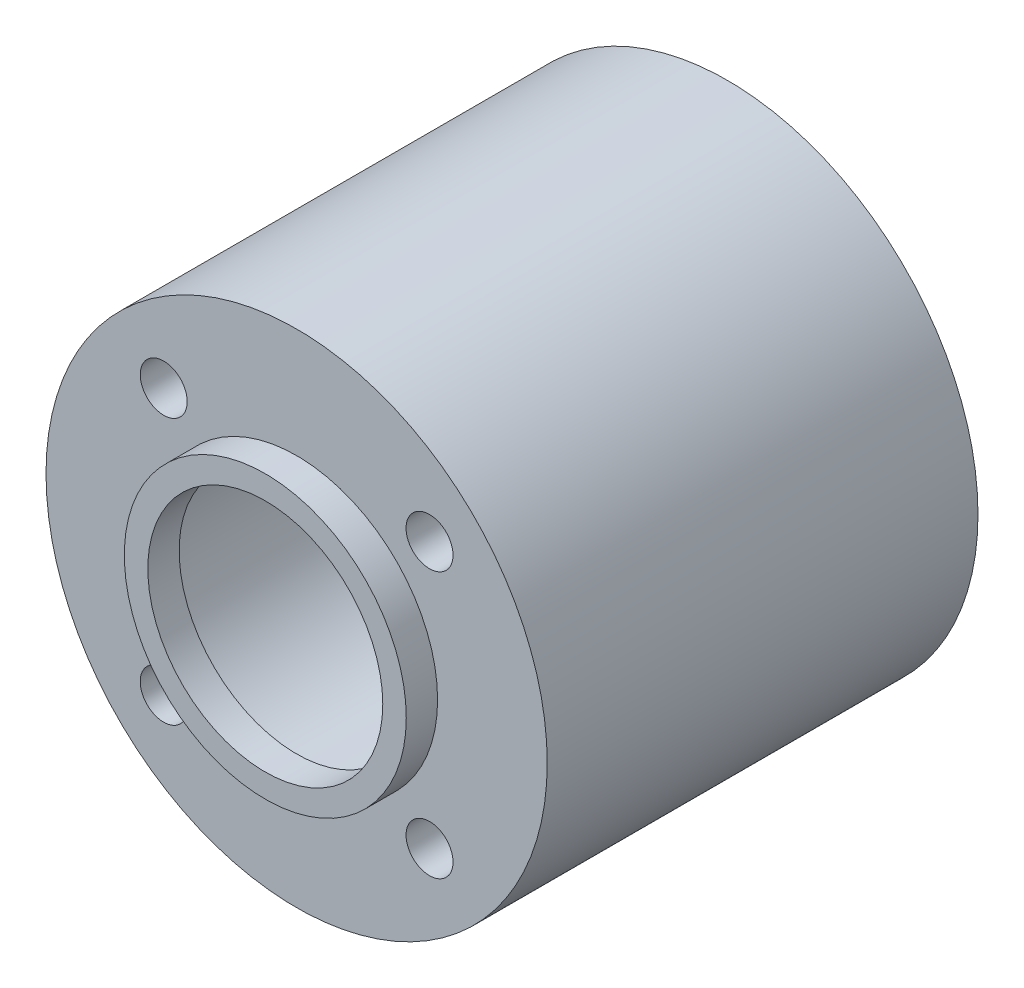
ISO-10303-21;
HEADER;
FILE_DESCRIPTION(('STEP AP214'),'2;1');
FILE_NAME('part.step','',(''),(''),'','','');
FILE_SCHEMA(('AUTOMOTIVE_DESIGN { 1 0 10303 214 1 1 1 1 }'));
ENDSEC;
DATA;
#1=APPLICATION_CONTEXT('core data for automotive mechanical design processes');
#2=APPLICATION_PROTOCOL_DEFINITION('international standard','automotive_design',2000,#1);
#3=PRODUCT_CONTEXT('',#1,'mechanical');
#4=PRODUCT('Part','Part','',(#3));
#5=PRODUCT_RELATED_PRODUCT_CATEGORY('part','',(#4));
#6=PRODUCT_DEFINITION_FORMATION('','',#4);
#7=PRODUCT_DEFINITION_CONTEXT('part definition',#1,'design');
#8=PRODUCT_DEFINITION('design','',#6,#7);
#9=PRODUCT_DEFINITION_SHAPE('','',#8);
#10=(LENGTH_UNIT() NAMED_UNIT(*) SI_UNIT(.MILLI.,.METRE.));
#11=(NAMED_UNIT(*) PLANE_ANGLE_UNIT() SI_UNIT($,.RADIAN.));
#12=(NAMED_UNIT(*) SI_UNIT($,.STERADIAN.) SOLID_ANGLE_UNIT());
#13=UNCERTAINTY_MEASURE_WITH_UNIT(LENGTH_MEASURE(1.E-05),#10,'distance_accuracy_value','');
#14=(GEOMETRIC_REPRESENTATION_CONTEXT(3) GLOBAL_UNCERTAINTY_ASSIGNED_CONTEXT((#13)) GLOBAL_UNIT_ASSIGNED_CONTEXT((#10,
#11,#12)) REPRESENTATION_CONTEXT('',''));
#15=CARTESIAN_POINT('',(0.,0.,0.));
#16=DIRECTION('',(0.,0.,1.));
#17=DIRECTION('',(1.,0.,0.));
#18=AXIS2_PLACEMENT_3D('',#15,#16,#17);
#19=CARTESIAN_POINT('',(0.,0.,2.));
#20=DIRECTION('',(0.,0.,-1.));
#21=DIRECTION('',(-1.,0.,0.));
#22=AXIS2_PLACEMENT_3D('',#19,#20,#21);
#23=CYLINDRICAL_SURFACE('',#22,7.5);
#24=CARTESIAN_POINT('',(0.,0.,2.));
#25=DIRECTION('',(0.,0.,1.));
#26=DIRECTION('',(1.,0.,0.));
#27=AXIS2_PLACEMENT_3D('',#24,#25,#26);
#28=CIRCLE('',#27,7.5);
#29=CARTESIAN_POINT('',(7.5,0.,2.));
#30=VERTEX_POINT('',#29);
#31=EDGE_CURVE('E58',#30,#30,#28,.T.);
#32=ORIENTED_EDGE('',*,*,#31,.T.);
#33=EDGE_LOOP('',(#32));
#34=FACE_BOUND('',#33,.T.);
#35=CARTESIAN_POINT('',(0.,0.,0.));
#36=DIRECTION('',(0.,0.,1.));
#37=DIRECTION('',(1.,0.,0.));
#38=AXIS2_PLACEMENT_3D('',#35,#36,#37);
#39=CIRCLE('',#38,7.5);
#40=CARTESIAN_POINT('',(7.5,0.,0.));
#41=VERTEX_POINT('',#40);
#42=EDGE_CURVE('E64',#41,#41,#39,.T.);
#43=ORIENTED_EDGE('',*,*,#42,.F.);
#44=EDGE_LOOP('',(#43));
#45=FACE_BOUND('',#44,.T.);
#46=ADVANCED_FACE('F51',(#34,#45),#23,.F.);
#47=CARTESIAN_POINT('',(0.,0.,2.));
#48=DIRECTION('',(0.,0.,-1.));
#49=DIRECTION('',(-1.,0.,0.));
#50=AXIS2_PLACEMENT_3D('',#47,#48,#49);
#51=CYLINDRICAL_SURFACE('',#50,9.);
#52=CARTESIAN_POINT('',(0.,0.,2.));
#53=DIRECTION('',(0.,0.,1.));
#54=DIRECTION('',(1.,0.,0.));
#55=AXIS2_PLACEMENT_3D('',#52,#53,#54);
#56=CIRCLE('',#55,9.);
#57=CARTESIAN_POINT('',(9.,0.,2.));
#58=VERTEX_POINT('',#57);
#59=EDGE_CURVE('E11',#58,#58,#56,.T.);
#60=ORIENTED_EDGE('',*,*,#59,.F.);
#61=EDGE_LOOP('',(#60));
#62=FACE_BOUND('',#61,.T.);
#63=CARTESIAN_POINT('',(0.,0.,0.));
#64=DIRECTION('',(0.,0.,1.));
#65=DIRECTION('',(1.,0.,0.));
#66=AXIS2_PLACEMENT_3D('',#63,#64,#65);
#67=CIRCLE('',#66,9.);
#68=CARTESIAN_POINT('',(9.,0.,0.));
#69=VERTEX_POINT('',#68);
#70=EDGE_CURVE('E54',#69,#69,#67,.T.);
#71=ORIENTED_EDGE('',*,*,#70,.T.);
#72=EDGE_LOOP('',(#71));
#73=FACE_BOUND('',#72,.T.);
#74=ADVANCED_FACE('F71',(#62,#73),#51,.T.);
#75=CARTESIAN_POINT('',(0.,0.,2.));
#76=DIRECTION('',(0.,0.,1.));
#77=DIRECTION('',(1.,0.,0.));
#78=AXIS2_PLACEMENT_3D('',#75,#76,#77);
#79=PLANE('',#78);
#80=ORIENTED_EDGE('',*,*,#31,.F.);
#81=EDGE_LOOP('',(#80));
#82=FACE_BOUND('',#81,.T.);
#83=ORIENTED_EDGE('',*,*,#59,.T.);
#84=EDGE_LOOP('',(#83));
#85=FACE_BOUND('',#84,.T.);
#86=ADVANCED_FACE('F75',(#82,#85),#79,.T.);
#87=CARTESIAN_POINT('',(0.,0.,0.));
#88=DIRECTION('',(0.,0.,1.));
#89=DIRECTION('',(1.,0.,0.));
#90=AXIS2_PLACEMENT_3D('',#87,#88,#89);
#91=PLANE('',#90);
#92=ORIENTED_EDGE('',*,*,#42,.T.);
#93=EDGE_LOOP('',(#92));
#94=FACE_BOUND('',#93,.T.);
#95=ORIENTED_EDGE('',*,*,#70,.F.);
#96=EDGE_LOOP('',(#95));
#97=FACE_BOUND('',#96,.T.);
#98=ADVANCED_FACE('F73',(#94,#97),#91,.F.);
#99=CLOSED_SHELL('',(#46,#74,#86,#98));
#100=MANIFOLD_SOLID_BREP('B2',#99);
#101=CARTESIAN_POINT('',(0.,0.,-27.5));
#102=DIRECTION('',(0.,0.,1.));
#103=DIRECTION('',(1.,0.,0.));
#104=AXIS2_PLACEMENT_3D('',#101,#102,#103);
#105=CYLINDRICAL_SURFACE('',#104,9.);
#106=CARTESIAN_POINT('',(0.,0.,-27.5));
#107=DIRECTION('',(0.,0.,1.));
#108=DIRECTION('',(1.,0.,0.));
#109=AXIS2_PLACEMENT_3D('',#106,#107,#108);
#110=CIRCLE('',#109,9.);
#111=CARTESIAN_POINT('',(9.,0.,-27.5));
#112=VERTEX_POINT('',#111);
#113=EDGE_CURVE('E130',#112,#112,#110,.T.);
#114=ORIENTED_EDGE('',*,*,#113,.F.);
#115=EDGE_LOOP('',(#114));
#116=FACE_BOUND('',#115,.T.);
#117=CARTESIAN_POINT('',(0.,0.,0.));
#118=DIRECTION('',(0.,0.,1.));
#119=DIRECTION('',(1.,0.,0.));
#120=AXIS2_PLACEMENT_3D('',#117,#118,#119);
#121=CIRCLE('',#120,9.);
#122=CARTESIAN_POINT('',(9.,0.,0.));
#123=VERTEX_POINT('',#122);
#124=EDGE_CURVE('E155',#123,#123,#121,.T.);
#125=ORIENTED_EDGE('',*,*,#124,.T.);
#126=EDGE_LOOP('',(#125));
#127=FACE_BOUND('',#126,.T.);
#128=ADVANCED_FACE('F121',(#116,#127),#105,.F.);
#129=CARTESIAN_POINT('',(-8.48528137423859,8.48528137423855,-27.5));
#130=DIRECTION('',(0.,0.,1.));
#131=DIRECTION('',(1.,0.,0.));
#132=AXIS2_PLACEMENT_3D('',#129,#130,#131);
#133=CYLINDRICAL_SURFACE('',#132,1.5);
#134=CARTESIAN_POINT('',(-8.48528137423859,8.48528137423855,-27.5));
#135=DIRECTION('',(0.,0.,1.));
#136=DIRECTION('',(1.,0.,0.));
#137=AXIS2_PLACEMENT_3D('',#134,#135,#136);
#138=CIRCLE('',#137,1.5);
#139=CARTESIAN_POINT('',(-6.98528137423859,8.48528137423855,-27.5));
#140=VERTEX_POINT('',#139);
#141=EDGE_CURVE('E136',#140,#140,#138,.T.);
#142=ORIENTED_EDGE('',*,*,#141,.F.);
#143=EDGE_LOOP('',(#142));
#144=FACE_BOUND('',#143,.T.);
#145=CARTESIAN_POINT('',(-8.48528137423859,8.48528137423855,0.));
#146=DIRECTION('',(0.,0.,1.));
#147=DIRECTION('',(1.,0.,0.));
#148=AXIS2_PLACEMENT_3D('',#145,#146,#147);
#149=CIRCLE('',#148,1.5);
#150=CARTESIAN_POINT('',(-6.98528137423859,8.48528137423855,0.));
#151=VERTEX_POINT('',#150);
#152=EDGE_CURVE('E152',#151,#151,#149,.T.);
#153=ORIENTED_EDGE('',*,*,#152,.T.);
#154=EDGE_LOOP('',(#153));
#155=FACE_BOUND('',#154,.T.);
#156=ADVANCED_FACE('F185',(#144,#155),#133,.F.);
#157=CARTESIAN_POINT('',(8.48528137423855,8.48528137423906,-27.5));
#158=DIRECTION('',(0.,0.,1.));
#159=DIRECTION('',(1.,0.,0.));
#160=AXIS2_PLACEMENT_3D('',#157,#158,#159);
#161=CYLINDRICAL_SURFACE('',#160,1.50000000000049);
#162=CARTESIAN_POINT('',(8.48528137423855,8.48528137423906,-27.5));
#163=DIRECTION('',(0.,0.,1.));
#164=DIRECTION('',(1.,0.,0.));
#165=AXIS2_PLACEMENT_3D('',#162,#163,#164);
#166=CIRCLE('',#165,1.50000000000049);
#167=CARTESIAN_POINT('',(9.98528137423905,8.48528137423906,-27.5));
#168=VERTEX_POINT('',#167);
#169=EDGE_CURVE('E173',#168,#168,#166,.T.);
#170=ORIENTED_EDGE('',*,*,#169,.F.);
#171=EDGE_LOOP('',(#170));
#172=FACE_BOUND('',#171,.T.);
#173=CARTESIAN_POINT('',(8.48528137423855,8.48528137423906,0.));
#174=DIRECTION('',(0.,0.,1.));
#175=DIRECTION('',(1.,0.,0.));
#176=AXIS2_PLACEMENT_3D('',#173,#174,#175);
#177=CIRCLE('',#176,1.50000000000049);
#178=CARTESIAN_POINT('',(9.98528137423905,8.48528137423906,0.));
#179=VERTEX_POINT('',#178);
#180=EDGE_CURVE('E148',#179,#179,#177,.T.);
#181=ORIENTED_EDGE('',*,*,#180,.T.);
#182=EDGE_LOOP('',(#181));
#183=FACE_BOUND('',#182,.T.);
#184=ADVANCED_FACE('F188',(#172,#183),#161,.F.);
#185=CARTESIAN_POINT('',(8.48528137423907,-8.48528137423807,-27.5));
#186=DIRECTION('',(0.,0.,1.));
#187=DIRECTION('',(1.,0.,0.));
#188=AXIS2_PLACEMENT_3D('',#185,#186,#187);
#189=CYLINDRICAL_SURFACE('',#188,1.50000000000067);
#190=CARTESIAN_POINT('',(8.48528137423907,-8.48528137423807,-27.5));
#191=DIRECTION('',(0.,0.,1.));
#192=DIRECTION('',(1.,0.,0.));
#193=AXIS2_PLACEMENT_3D('',#190,#191,#192);
#194=CIRCLE('',#193,1.50000000000067);
#195=CARTESIAN_POINT('',(9.98528137423974,-8.48528137423807,-27.5));
#196=VERTEX_POINT('',#195);
#197=EDGE_CURVE('E167',#196,#196,#194,.T.);
#198=ORIENTED_EDGE('',*,*,#197,.F.);
#199=EDGE_LOOP('',(#198));
#200=FACE_BOUND('',#199,.T.);
#201=CARTESIAN_POINT('',(8.48528137423907,-8.48528137423807,0.));
#202=DIRECTION('',(0.,0.,1.));
#203=DIRECTION('',(1.,0.,0.));
#204=AXIS2_PLACEMENT_3D('',#201,#202,#203);
#205=CIRCLE('',#204,1.50000000000067);
#206=CARTESIAN_POINT('',(9.98528137423974,-8.48528137423807,0.));
#207=VERTEX_POINT('',#206);
#208=EDGE_CURVE('E144',#207,#207,#205,.T.);
#209=ORIENTED_EDGE('',*,*,#208,.T.);
#210=EDGE_LOOP('',(#209));
#211=FACE_BOUND('',#210,.T.);
#212=ADVANCED_FACE('F213',(#200,#211),#189,.F.);
#213=CARTESIAN_POINT('',(-8.48528137423807,-8.48528137423859,-27.5));
#214=DIRECTION('',(0.,0.,1.));
#215=DIRECTION('',(1.,0.,0.));
#216=AXIS2_PLACEMENT_3D('',#213,#214,#215);
#217=CYLINDRICAL_SURFACE('',#216,1.50000000000025);
#218=CARTESIAN_POINT('',(-8.48528137423807,-8.48528137423859,-27.5));
#219=DIRECTION('',(0.,0.,1.));
#220=DIRECTION('',(1.,0.,0.));
#221=AXIS2_PLACEMENT_3D('',#218,#219,#220);
#222=CIRCLE('',#221,1.50000000000025);
#223=CARTESIAN_POINT('',(-6.98528137423782,-8.48528137423859,-27.5));
#224=VERTEX_POINT('',#223);
#225=EDGE_CURVE('E162',#224,#224,#222,.T.);
#226=ORIENTED_EDGE('',*,*,#225,.F.);
#227=EDGE_LOOP('',(#226));
#228=FACE_BOUND('',#227,.T.);
#229=CARTESIAN_POINT('',(-8.48528137423807,-8.48528137423859,0.));
#230=DIRECTION('',(0.,0.,1.));
#231=DIRECTION('',(1.,0.,0.));
#232=AXIS2_PLACEMENT_3D('',#229,#230,#231);
#233=CIRCLE('',#232,1.50000000000025);
#234=CARTESIAN_POINT('',(-6.98528137423782,-8.48528137423859,0.));
#235=VERTEX_POINT('',#234);
#236=EDGE_CURVE('E140',#235,#235,#233,.T.);
#237=ORIENTED_EDGE('',*,*,#236,.T.);
#238=EDGE_LOOP('',(#237));
#239=FACE_BOUND('',#238,.T.);
#240=ADVANCED_FACE('F123',(#228,#239),#217,.F.);
#241=CARTESIAN_POINT('',(0.,0.,-27.5));
#242=DIRECTION('',(0.,0.,1.));
#243=DIRECTION('',(1.,0.,0.));
#244=AXIS2_PLACEMENT_3D('',#241,#242,#243);
#245=CYLINDRICAL_SURFACE('',#244,16.);
#246=CARTESIAN_POINT('',(0.,0.,-27.5));
#247=DIRECTION('',(0.,0.,1.));
#248=DIRECTION('',(1.,0.,0.));
#249=AXIS2_PLACEMENT_3D('',#246,#247,#248);
#250=CIRCLE('',#249,16.);
#251=CARTESIAN_POINT('',(16.,0.,-27.5));
#252=VERTEX_POINT('',#251);
#253=EDGE_CURVE('E50',#252,#252,#250,.T.);
#254=ORIENTED_EDGE('',*,*,#253,.T.);
#255=EDGE_LOOP('',(#254));
#256=FACE_BOUND('',#255,.T.);
#257=CARTESIAN_POINT('',(0.,0.,0.));
#258=DIRECTION('',(0.,0.,1.));
#259=DIRECTION('',(1.,0.,0.));
#260=AXIS2_PLACEMENT_3D('',#257,#258,#259);
#261=CIRCLE('',#260,16.);
#262=CARTESIAN_POINT('',(16.,0.,0.));
#263=VERTEX_POINT('',#262);
#264=EDGE_CURVE('E125',#263,#263,#261,.T.);
#265=ORIENTED_EDGE('',*,*,#264,.F.);
#266=EDGE_LOOP('',(#265));
#267=FACE_BOUND('',#266,.T.);
#268=ADVANCED_FACE('F200',(#256,#267),#245,.T.);
#269=CARTESIAN_POINT('',(0.,0.,-27.5));
#270=DIRECTION('',(0.,0.,1.));
#271=DIRECTION('',(1.,0.,0.));
#272=AXIS2_PLACEMENT_3D('',#269,#270,#271);
#273=PLANE('',#272);
#274=ORIENTED_EDGE('',*,*,#225,.T.);
#275=EDGE_LOOP('',(#274));
#276=FACE_BOUND('',#275,.T.);
#277=ORIENTED_EDGE('',*,*,#197,.T.);
#278=EDGE_LOOP('',(#277));
#279=FACE_BOUND('',#278,.T.);
#280=ORIENTED_EDGE('',*,*,#169,.T.);
#281=EDGE_LOOP('',(#280));
#282=FACE_BOUND('',#281,.T.);
#283=ORIENTED_EDGE('',*,*,#141,.T.);
#284=EDGE_LOOP('',(#283));
#285=FACE_BOUND('',#284,.T.);
#286=ORIENTED_EDGE('',*,*,#113,.T.);
#287=EDGE_LOOP('',(#286));
#288=FACE_BOUND('',#287,.T.);
#289=ORIENTED_EDGE('',*,*,#253,.F.);
#290=EDGE_LOOP('',(#289));
#291=FACE_BOUND('',#290,.T.);
#292=ADVANCED_FACE('F182',(#276,#279,#282,#285,#288,#291),#273,.F.);
#293=CARTESIAN_POINT('',(0.,0.,0.));
#294=DIRECTION('',(0.,0.,1.));
#295=DIRECTION('',(1.,0.,0.));
#296=AXIS2_PLACEMENT_3D('',#293,#294,#295);
#297=PLANE('',#296);
#298=ORIENTED_EDGE('',*,*,#236,.F.);
#299=EDGE_LOOP('',(#298));
#300=FACE_BOUND('',#299,.T.);
#301=ORIENTED_EDGE('',*,*,#208,.F.);
#302=EDGE_LOOP('',(#301));
#303=FACE_BOUND('',#302,.T.);
#304=ORIENTED_EDGE('',*,*,#180,.F.);
#305=EDGE_LOOP('',(#304));
#306=FACE_BOUND('',#305,.T.);
#307=ORIENTED_EDGE('',*,*,#152,.F.);
#308=EDGE_LOOP('',(#307));
#309=FACE_BOUND('',#308,.T.);
#310=ORIENTED_EDGE('',*,*,#124,.F.);
#311=EDGE_LOOP('',(#310));
#312=FACE_BOUND('',#311,.T.);
#313=ORIENTED_EDGE('',*,*,#264,.T.);
#314=EDGE_LOOP('',(#313));
#315=FACE_BOUND('',#314,.T.);
#316=ADVANCED_FACE('F192',(#300,#303,#306,#309,#312,#315),#297,.T.);
#317=CLOSED_SHELL('',(#128,#156,#184,#212,#240,#268,#292,#316));
#318=MANIFOLD_SOLID_BREP('B6',#317);
#319=ADVANCED_BREP_SHAPE_REPRESENTATION('',(#18,#100,#318),#14);
#320=SHAPE_DEFINITION_REPRESENTATION(#9,#319);
ENDSEC;
END-ISO-10303-21;
